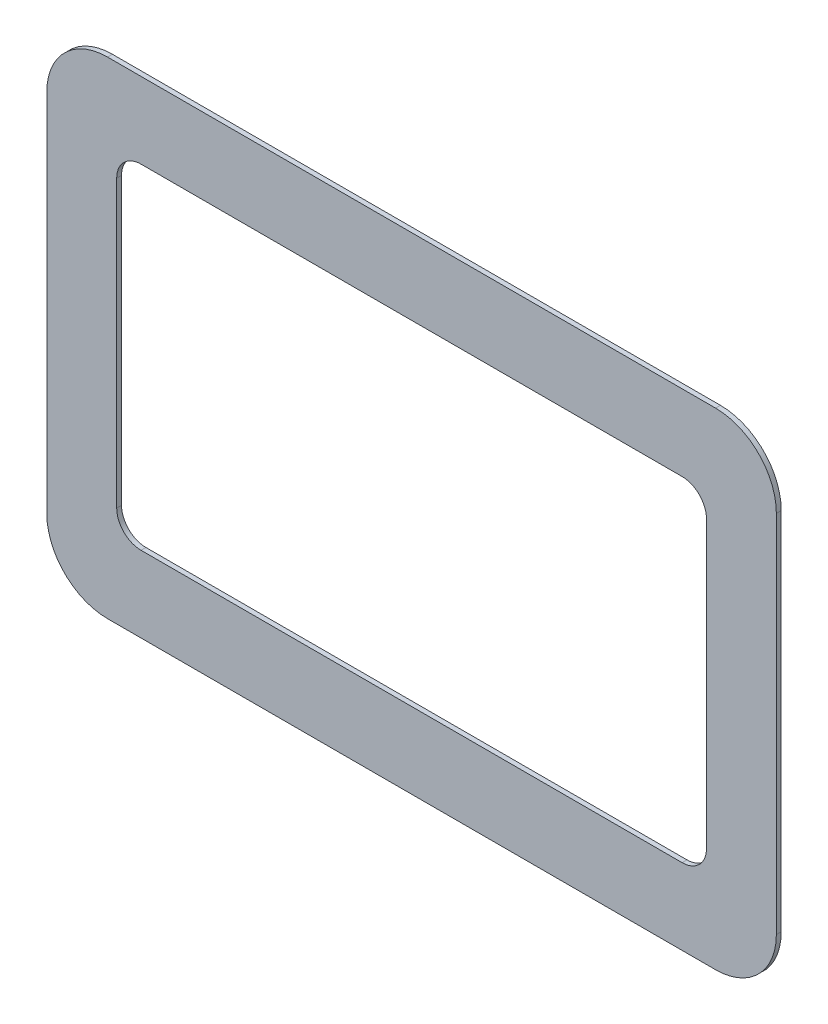
ISO-10303-21;
HEADER;
FILE_DESCRIPTION(('STEP AP214'),'2;1');
FILE_NAME('part.step','',(''),(''),'','','');
FILE_SCHEMA(('AUTOMOTIVE_DESIGN { 1 0 10303 214 1 1 1 1 }'));
ENDSEC;
DATA;
#1=APPLICATION_CONTEXT('core data for automotive mechanical design processes');
#2=APPLICATION_PROTOCOL_DEFINITION('international standard','automotive_design',2000,#1);
#3=PRODUCT_CONTEXT('',#1,'mechanical');
#4=PRODUCT('Part','Part','',(#3));
#5=PRODUCT_RELATED_PRODUCT_CATEGORY('part','',(#4));
#6=PRODUCT_DEFINITION_FORMATION('','',#4);
#7=PRODUCT_DEFINITION_CONTEXT('part definition',#1,'design');
#8=PRODUCT_DEFINITION('design','',#6,#7);
#9=PRODUCT_DEFINITION_SHAPE('','',#8);
#10=(LENGTH_UNIT() NAMED_UNIT(*) SI_UNIT(.MILLI.,.METRE.));
#11=(NAMED_UNIT(*) PLANE_ANGLE_UNIT() SI_UNIT($,.RADIAN.));
#12=(NAMED_UNIT(*) SI_UNIT($,.STERADIAN.) SOLID_ANGLE_UNIT());
#13=UNCERTAINTY_MEASURE_WITH_UNIT(LENGTH_MEASURE(1.E-05),#10,'distance_accuracy_value','');
#14=(GEOMETRIC_REPRESENTATION_CONTEXT(3) GLOBAL_UNCERTAINTY_ASSIGNED_CONTEXT((#13)) GLOBAL_UNIT_ASSIGNED_CONTEXT((#10,
#11,#12)) REPRESENTATION_CONTEXT('',''));
#15=CARTESIAN_POINT('',(0.,0.,0.));
#16=DIRECTION('',(0.,0.,1.));
#17=DIRECTION('',(1.,0.,0.));
#18=AXIS2_PLACEMENT_3D('',#15,#16,#17);
#19=CARTESIAN_POINT('',(289.706390991234,-144.607906080898,4.));
#20=DIRECTION('',(0.,0.,-1.));
#21=DIRECTION('',(-1.,0.,0.));
#22=AXIS2_PLACEMENT_3D('',#19,#20,#21);
#23=CYLINDRICAL_SURFACE('',#22,50.);
#24=CARTESIAN_POINT('',(289.706390991234,-144.607906080898,0.));
#25=DIRECTION('',(0.,0.,1.));
#26=DIRECTION('',(1.,0.,0.));
#27=AXIS2_PLACEMENT_3D('',#24,#25,#26);
#28=CIRCLE('',#27,50.);
#29=CARTESIAN_POINT('',(289.706390991234,-194.607906080898,0.));
#30=VERTEX_POINT('',#29);
#31=CARTESIAN_POINT('',(339.706390991234,-144.607906080898,0.));
#32=VERTEX_POINT('',#31);
#33=EDGE_CURVE('E202',#30,#32,#28,.T.);
#34=ORIENTED_EDGE('',*,*,#33,.T.);
#35=DIRECTION('',(0.,0.,-1.));
#36=VECTOR('',#35,1.);
#37=CARTESIAN_POINT('',(339.706390991234,-144.607906080898,4.));
#38=LINE('',#37,#36);
#39=CARTESIAN_POINT('',(339.706390991234,-144.607906080898,4.));
#40=VERTEX_POINT('',#39);
#41=EDGE_CURVE('E11',#40,#32,#38,.T.);
#42=ORIENTED_EDGE('',*,*,#41,.F.);
#43=CARTESIAN_POINT('',(289.706390991234,-144.607906080898,4.));
#44=DIRECTION('',(0.,0.,1.));
#45=DIRECTION('',(1.,0.,0.));
#46=AXIS2_PLACEMENT_3D('',#43,#44,#45);
#47=CIRCLE('',#46,50.);
#48=CARTESIAN_POINT('',(289.706390991234,-194.607906080898,4.));
#49=VERTEX_POINT('',#48);
#50=EDGE_CURVE('E214',#49,#40,#47,.T.);
#51=ORIENTED_EDGE('',*,*,#50,.F.);
#52=DIRECTION('',(0.,0.,-1.));
#53=VECTOR('',#52,1.);
#54=CARTESIAN_POINT('',(289.706390991234,-194.607906080898,4.));
#55=LINE('',#54,#53);
#56=EDGE_CURVE('E232',#49,#30,#55,.T.);
#57=ORIENTED_EDGE('',*,*,#56,.T.);
#58=EDGE_LOOP('',(#34,#42,#51,#57));
#59=FACE_BOUND('',#58,.T.);
#60=ADVANCED_FACE('F33',(#59),#23,.T.);
#61=CARTESIAN_POINT('',(339.706390991234,-144.607906080898,4.));
#62=DIRECTION('',(-1.,0.,0.));
#63=DIRECTION('',(0.,0.,1.));
#64=AXIS2_PLACEMENT_3D('',#61,#62,#63);
#65=PLANE('',#64);
#66=DIRECTION('',(0.,1.,0.));
#67=VECTOR('',#66,1.);
#68=CARTESIAN_POINT('',(339.706390991234,-144.607906080898,0.));
#69=LINE('',#68,#67);
#70=CARTESIAN_POINT('',(339.706390991234,155.392093919102,0.));
#71=VERTEX_POINT('',#70);
#72=EDGE_CURVE('E235',#32,#71,#69,.T.);
#73=ORIENTED_EDGE('',*,*,#72,.T.);
#74=DIRECTION('',(0.,0.,-1.));
#75=VECTOR('',#74,1.);
#76=CARTESIAN_POINT('',(339.706390991234,155.392093919102,4.));
#77=LINE('',#76,#75);
#78=CARTESIAN_POINT('',(339.706390991234,155.392093919102,4.));
#79=VERTEX_POINT('',#78);
#80=EDGE_CURVE('E40',#79,#71,#77,.T.);
#81=ORIENTED_EDGE('',*,*,#80,.F.);
#82=DIRECTION('',(0.,1.,0.));
#83=VECTOR('',#82,1.);
#84=CARTESIAN_POINT('',(339.706390991234,-144.607906080898,4.));
#85=LINE('',#84,#83);
#86=EDGE_CURVE('E217',#40,#79,#85,.T.);
#87=ORIENTED_EDGE('',*,*,#86,.F.);
#88=ORIENTED_EDGE('',*,*,#41,.T.);
#89=EDGE_LOOP('',(#73,#81,#87,#88));
#90=FACE_BOUND('',#89,.T.);
#91=ADVANCED_FACE('F290',(#90),#65,.F.);
#92=CARTESIAN_POINT('',(289.706390991234,155.392093919102,4.));
#93=DIRECTION('',(0.,0.,-1.));
#94=DIRECTION('',(-1.,0.,0.));
#95=AXIS2_PLACEMENT_3D('',#92,#93,#94);
#96=CYLINDRICAL_SURFACE('',#95,50.);
#97=CARTESIAN_POINT('',(289.706390991234,155.392093919102,0.));
#98=DIRECTION('',(0.,0.,1.));
#99=DIRECTION('',(-1.,0.,0.));
#100=AXIS2_PLACEMENT_3D('',#97,#98,#99);
#101=CIRCLE('',#100,50.);
#102=CARTESIAN_POINT('',(289.706390991234,205.392093919102,0.));
#103=VERTEX_POINT('',#102);
#104=EDGE_CURVE('E237',#71,#103,#101,.T.);
#105=ORIENTED_EDGE('',*,*,#104,.T.);
#106=DIRECTION('',(0.,0.,-1.));
#107=VECTOR('',#106,1.);
#108=CARTESIAN_POINT('',(289.706390991234,205.392093919102,4.));
#109=LINE('',#108,#107);
#110=CARTESIAN_POINT('',(289.706390991234,205.392093919102,4.));
#111=VERTEX_POINT('',#110);
#112=EDGE_CURVE('E262',#111,#103,#109,.T.);
#113=ORIENTED_EDGE('',*,*,#112,.F.);
#114=CARTESIAN_POINT('',(289.706390991234,155.392093919102,4.));
#115=DIRECTION('',(0.,0.,1.));
#116=DIRECTION('',(-1.,0.,0.));
#117=AXIS2_PLACEMENT_3D('',#114,#115,#116);
#118=CIRCLE('',#117,50.);
#119=EDGE_CURVE('E220',#79,#111,#118,.T.);
#120=ORIENTED_EDGE('',*,*,#119,.F.);
#121=ORIENTED_EDGE('',*,*,#80,.T.);
#122=EDGE_LOOP('',(#105,#113,#120,#121));
#123=FACE_BOUND('',#122,.T.);
#124=ADVANCED_FACE('F269',(#123),#96,.T.);
#125=CARTESIAN_POINT('',(-210.293609008766,205.392093919102,4.));
#126=DIRECTION('',(0.,-1.,0.));
#127=DIRECTION('',(0.,0.,-1.));
#128=AXIS2_PLACEMENT_3D('',#125,#126,#127);
#129=PLANE('',#128);
#130=DIRECTION('',(-1.,0.,0.));
#131=VECTOR('',#130,1.);
#132=CARTESIAN_POINT('',(-210.293609008766,205.392093919102,0.));
#133=LINE('',#132,#131);
#134=CARTESIAN_POINT('',(-210.293609008766,205.392093919102,0.));
#135=VERTEX_POINT('',#134);
#136=EDGE_CURVE('E239',#103,#135,#133,.T.);
#137=ORIENTED_EDGE('',*,*,#136,.T.);
#138=DIRECTION('',(0.,0.,-1.));
#139=VECTOR('',#138,1.);
#140=CARTESIAN_POINT('',(-210.293609008766,205.392093919102,4.));
#141=LINE('',#140,#139);
#142=CARTESIAN_POINT('',(-210.293609008766,205.392093919102,4.));
#143=VERTEX_POINT('',#142);
#144=EDGE_CURVE('E259',#143,#135,#141,.T.);
#145=ORIENTED_EDGE('',*,*,#144,.F.);
#146=DIRECTION('',(-1.,0.,0.));
#147=VECTOR('',#146,1.);
#148=CARTESIAN_POINT('',(-210.293609008766,205.392093919102,4.));
#149=LINE('',#148,#147);
#150=EDGE_CURVE('E222',#111,#143,#149,.T.);
#151=ORIENTED_EDGE('',*,*,#150,.F.);
#152=ORIENTED_EDGE('',*,*,#112,.T.);
#153=EDGE_LOOP('',(#137,#145,#151,#152));
#154=FACE_BOUND('',#153,.T.);
#155=ADVANCED_FACE('F278',(#154),#129,.F.);
#156=CARTESIAN_POINT('',(-210.293609008766,155.392093919102,4.));
#157=DIRECTION('',(0.,0.,-1.));
#158=DIRECTION('',(-1.,0.,0.));
#159=AXIS2_PLACEMENT_3D('',#156,#157,#158);
#160=CYLINDRICAL_SURFACE('',#159,50.);
#161=CARTESIAN_POINT('',(-210.293609008766,155.392093919102,0.));
#162=DIRECTION('',(0.,0.,1.));
#163=DIRECTION('',(-1.,0.,0.));
#164=AXIS2_PLACEMENT_3D('',#161,#162,#163);
#165=CIRCLE('',#164,50.);
#166=CARTESIAN_POINT('',(-260.293609008766,155.392093919102,0.));
#167=VERTEX_POINT('',#166);
#168=EDGE_CURVE('E241',#135,#167,#165,.T.);
#169=ORIENTED_EDGE('',*,*,#168,.T.);
#170=DIRECTION('',(0.,0.,-1.));
#171=VECTOR('',#170,1.);
#172=CARTESIAN_POINT('',(-260.293609008766,155.392093919102,4.));
#173=LINE('',#172,#171);
#174=CARTESIAN_POINT('',(-260.293609008766,155.392093919102,4.));
#175=VERTEX_POINT('',#174);
#176=EDGE_CURVE('E256',#175,#167,#173,.T.);
#177=ORIENTED_EDGE('',*,*,#176,.F.);
#178=CARTESIAN_POINT('',(-210.293609008766,155.392093919102,4.));
#179=DIRECTION('',(0.,0.,1.));
#180=DIRECTION('',(-1.,0.,0.));
#181=AXIS2_PLACEMENT_3D('',#178,#179,#180);
#182=CIRCLE('',#181,50.);
#183=EDGE_CURVE('E224',#143,#175,#182,.T.);
#184=ORIENTED_EDGE('',*,*,#183,.F.);
#185=ORIENTED_EDGE('',*,*,#144,.T.);
#186=EDGE_LOOP('',(#169,#177,#184,#185));
#187=FACE_BOUND('',#186,.T.);
#188=ADVANCED_FACE('F282',(#187),#160,.T.);
#189=CARTESIAN_POINT('',(-260.293609008766,-144.607906080898,4.));
#190=DIRECTION('',(1.,0.,0.));
#191=DIRECTION('',(0.,0.,-1.));
#192=AXIS2_PLACEMENT_3D('',#189,#190,#191);
#193=PLANE('',#192);
#194=DIRECTION('',(0.,-1.,0.));
#195=VECTOR('',#194,1.);
#196=CARTESIAN_POINT('',(-260.293609008766,-144.607906080898,0.));
#197=LINE('',#196,#195);
#198=CARTESIAN_POINT('',(-260.293609008766,-144.607906080898,0.));
#199=VERTEX_POINT('',#198);
#200=EDGE_CURVE('E243',#167,#199,#197,.T.);
#201=ORIENTED_EDGE('',*,*,#200,.T.);
#202=DIRECTION('',(0.,0.,-1.));
#203=VECTOR('',#202,1.);
#204=CARTESIAN_POINT('',(-260.293609008766,-144.607906080898,4.));
#205=LINE('',#204,#203);
#206=CARTESIAN_POINT('',(-260.293609008766,-144.607906080898,4.));
#207=VERTEX_POINT('',#206);
#208=EDGE_CURVE('E253',#207,#199,#205,.T.);
#209=ORIENTED_EDGE('',*,*,#208,.F.);
#210=DIRECTION('',(0.,-1.,0.));
#211=VECTOR('',#210,1.);
#212=CARTESIAN_POINT('',(-260.293609008766,-144.607906080898,4.));
#213=LINE('',#212,#211);
#214=EDGE_CURVE('E226',#175,#207,#213,.T.);
#215=ORIENTED_EDGE('',*,*,#214,.F.);
#216=ORIENTED_EDGE('',*,*,#176,.T.);
#217=EDGE_LOOP('',(#201,#209,#215,#216));
#218=FACE_BOUND('',#217,.T.);
#219=ADVANCED_FACE('F303',(#218),#193,.F.);
#220=CARTESIAN_POINT('',(-210.293609008766,-144.607906080898,4.));
#221=DIRECTION('',(0.,0.,-1.));
#222=DIRECTION('',(-1.,0.,0.));
#223=AXIS2_PLACEMENT_3D('',#220,#221,#222);
#224=CYLINDRICAL_SURFACE('',#223,50.);
#225=CARTESIAN_POINT('',(-210.293609008766,-144.607906080898,0.));
#226=DIRECTION('',(0.,0.,1.));
#227=DIRECTION('',(-1.,0.,0.));
#228=AXIS2_PLACEMENT_3D('',#225,#226,#227);
#229=CIRCLE('',#228,50.);
#230=CARTESIAN_POINT('',(-210.293609008765,-194.607906080898,0.));
#231=VERTEX_POINT('',#230);
#232=EDGE_CURVE('E245',#199,#231,#229,.T.);
#233=ORIENTED_EDGE('',*,*,#232,.T.);
#234=DIRECTION('',(0.,0.,-1.));
#235=VECTOR('',#234,1.);
#236=CARTESIAN_POINT('',(-210.293609008765,-194.607906080898,4.));
#237=LINE('',#236,#235);
#238=CARTESIAN_POINT('',(-210.293609008765,-194.607906080898,4.));
#239=VERTEX_POINT('',#238);
#240=EDGE_CURVE('E250',#239,#231,#237,.T.);
#241=ORIENTED_EDGE('',*,*,#240,.F.);
#242=CARTESIAN_POINT('',(-210.293609008766,-144.607906080898,4.));
#243=DIRECTION('',(0.,0.,1.));
#244=DIRECTION('',(-1.,0.,0.));
#245=AXIS2_PLACEMENT_3D('',#242,#243,#244);
#246=CIRCLE('',#245,50.);
#247=EDGE_CURVE('E228',#207,#239,#246,.T.);
#248=ORIENTED_EDGE('',*,*,#247,.F.);
#249=ORIENTED_EDGE('',*,*,#208,.T.);
#250=EDGE_LOOP('',(#233,#241,#248,#249));
#251=FACE_BOUND('',#250,.T.);
#252=ADVANCED_FACE('F301',(#251),#224,.T.);
#253=CARTESIAN_POINT('',(-210.293609008765,-194.607906080898,4.));
#254=DIRECTION('',(0.,1.,0.));
#255=DIRECTION('',(0.,0.,1.));
#256=AXIS2_PLACEMENT_3D('',#253,#254,#255);
#257=PLANE('',#256);
#258=DIRECTION('',(1.,0.,0.));
#259=VECTOR('',#258,1.);
#260=CARTESIAN_POINT('',(-210.293609008765,-194.607906080898,0.));
#261=LINE('',#260,#259);
#262=EDGE_CURVE('E218',#231,#30,#261,.T.);
#263=ORIENTED_EDGE('',*,*,#262,.T.);
#264=ORIENTED_EDGE('',*,*,#56,.F.);
#265=DIRECTION('',(1.,0.,0.));
#266=VECTOR('',#265,1.);
#267=CARTESIAN_POINT('',(-210.293609008765,-194.607906080898,4.));
#268=LINE('',#267,#266);
#269=EDGE_CURVE('E230',#239,#49,#268,.T.);
#270=ORIENTED_EDGE('',*,*,#269,.F.);
#271=ORIENTED_EDGE('',*,*,#240,.T.);
#272=EDGE_LOOP('',(#263,#264,#270,#271));
#273=FACE_BOUND('',#272,.T.);
#274=ADVANCED_FACE('F296',(#273),#257,.F.);
#275=CARTESIAN_POINT('',(289.706390991234,-144.607906080898,4.));
#276=DIRECTION('',(0.,0.,1.));
#277=DIRECTION('',(1.,0.,0.));
#278=AXIS2_PLACEMENT_3D('',#275,#276,#277);
#279=PLANE('',#278);
#280=CARTESIAN_POINT('',(262.206390991234,-112.107906080898,4.));
#281=DIRECTION('',(0.,0.,1.));
#282=DIRECTION('',(1.,0.,0.));
#283=AXIS2_PLACEMENT_3D('',#280,#281,#282);
#284=CIRCLE('',#283,20.);
#285=CARTESIAN_POINT('',(262.206390991234,-132.107906080898,4.));
#286=VERTEX_POINT('',#285);
#287=CARTESIAN_POINT('',(282.206390991234,-112.107906080898,4.));
#288=VERTEX_POINT('',#287);
#289=EDGE_CURVE('E47',#286,#288,#284,.T.);
#290=ORIENTED_EDGE('',*,*,#289,.F.);
#291=DIRECTION('',(1.,0.,0.));
#292=VECTOR('',#291,1.);
#293=CARTESIAN_POINT('',(-182.793609008766,-132.107906080898,4.));
#294=LINE('',#293,#292);
#295=CARTESIAN_POINT('',(-182.793609008766,-132.107906080898,4.));
#296=VERTEX_POINT('',#295);
#297=EDGE_CURVE('E164',#296,#286,#294,.T.);
#298=ORIENTED_EDGE('',*,*,#297,.F.);
#299=CARTESIAN_POINT('',(-182.793609008766,-112.107906080898,4.));
#300=DIRECTION('',(0.,0.,1.));
#301=DIRECTION('',(-1.,0.,0.));
#302=AXIS2_PLACEMENT_3D('',#299,#300,#301);
#303=CIRCLE('',#302,20.);
#304=CARTESIAN_POINT('',(-202.793609008766,-112.107906080898,4.));
#305=VERTEX_POINT('',#304);
#306=EDGE_CURVE('E167',#305,#296,#303,.T.);
#307=ORIENTED_EDGE('',*,*,#306,.F.);
#308=DIRECTION('',(0.,-1.,0.));
#309=VECTOR('',#308,1.);
#310=CARTESIAN_POINT('',(-202.793609008766,-112.107906080898,4.));
#311=LINE('',#310,#309);
#312=CARTESIAN_POINT('',(-202.793609008766,122.892093919102,4.));
#313=VERTEX_POINT('',#312);
#314=EDGE_CURVE('E195',#313,#305,#311,.T.);
#315=ORIENTED_EDGE('',*,*,#314,.F.);
#316=CARTESIAN_POINT('',(-182.793609008766,122.892093919102,4.));
#317=DIRECTION('',(0.,0.,1.));
#318=DIRECTION('',(-1.,0.,0.));
#319=AXIS2_PLACEMENT_3D('',#316,#317,#318);
#320=CIRCLE('',#319,20.);
#321=CARTESIAN_POINT('',(-182.793609008766,142.892093919102,4.));
#322=VERTEX_POINT('',#321);
#323=EDGE_CURVE('E192',#322,#313,#320,.T.);
#324=ORIENTED_EDGE('',*,*,#323,.F.);
#325=DIRECTION('',(-1.,0.,0.));
#326=VECTOR('',#325,1.);
#327=CARTESIAN_POINT('',(-182.793609008766,142.892093919102,4.));
#328=LINE('',#327,#326);
#329=CARTESIAN_POINT('',(262.206390991234,142.892093919102,4.));
#330=VERTEX_POINT('',#329);
#331=EDGE_CURVE('E189',#330,#322,#328,.T.);
#332=ORIENTED_EDGE('',*,*,#331,.F.);
#333=CARTESIAN_POINT('',(262.206390991234,122.892093919102,4.));
#334=DIRECTION('',(0.,0.,1.));
#335=DIRECTION('',(-1.,0.,0.));
#336=AXIS2_PLACEMENT_3D('',#333,#334,#335);
#337=CIRCLE('',#336,20.);
#338=CARTESIAN_POINT('',(282.206390991234,122.892093919102,4.));
#339=VERTEX_POINT('',#338);
#340=EDGE_CURVE('E186',#339,#330,#337,.T.);
#341=ORIENTED_EDGE('',*,*,#340,.F.);
#342=DIRECTION('',(0.,1.,0.));
#343=VECTOR('',#342,1.);
#344=CARTESIAN_POINT('',(282.206390991234,-112.107906080898,4.));
#345=LINE('',#344,#343);
#346=EDGE_CURVE('E184',#288,#339,#345,.T.);
#347=ORIENTED_EDGE('',*,*,#346,.F.);
#348=EDGE_LOOP('',(#290,#298,#307,#315,#324,#332,#341,#347));
#349=FACE_BOUND('',#348,.T.);
#350=ORIENTED_EDGE('',*,*,#50,.T.);
#351=ORIENTED_EDGE('',*,*,#86,.T.);
#352=ORIENTED_EDGE('',*,*,#119,.T.);
#353=ORIENTED_EDGE('',*,*,#150,.T.);
#354=ORIENTED_EDGE('',*,*,#183,.T.);
#355=ORIENTED_EDGE('',*,*,#214,.T.);
#356=ORIENTED_EDGE('',*,*,#247,.T.);
#357=ORIENTED_EDGE('',*,*,#269,.T.);
#358=EDGE_LOOP('',(#350,#351,#352,#353,#354,#355,#356,#357));
#359=FACE_BOUND('',#358,.T.);
#360=ADVANCED_FACE('F286',(#349,#359),#279,.T.);
#361=CARTESIAN_POINT('',(289.706390991234,-144.607906080898,0.));
#362=DIRECTION('',(0.,0.,1.));
#363=DIRECTION('',(1.,0.,0.));
#364=AXIS2_PLACEMENT_3D('',#361,#362,#363);
#365=PLANE('',#364);
#366=DIRECTION('',(1.,0.,0.));
#367=VECTOR('',#366,1.);
#368=CARTESIAN_POINT('',(-182.793609008766,-132.107906080898,0.));
#369=LINE('',#368,#367);
#370=CARTESIAN_POINT('',(-182.793609008766,-132.107906080898,0.));
#371=VERTEX_POINT('',#370);
#372=CARTESIAN_POINT('',(262.206390991234,-132.107906080898,0.));
#373=VERTEX_POINT('',#372);
#374=EDGE_CURVE('E153',#371,#373,#369,.T.);
#375=ORIENTED_EDGE('',*,*,#374,.T.);
#376=CARTESIAN_POINT('',(262.206390991234,-112.107906080898,0.));
#377=DIRECTION('',(0.,0.,1.));
#378=DIRECTION('',(1.,0.,0.));
#379=AXIS2_PLACEMENT_3D('',#376,#377,#378);
#380=CIRCLE('',#379,20.);
#381=CARTESIAN_POINT('',(282.206390991234,-112.107906080898,0.));
#382=VERTEX_POINT('',#381);
#383=EDGE_CURVE('E147',#373,#382,#380,.T.);
#384=ORIENTED_EDGE('',*,*,#383,.T.);
#385=DIRECTION('',(0.,1.,0.));
#386=VECTOR('',#385,1.);
#387=CARTESIAN_POINT('',(282.206390991234,-112.107906080898,0.));
#388=LINE('',#387,#386);
#389=CARTESIAN_POINT('',(282.206390991234,122.892093919102,0.));
#390=VERTEX_POINT('',#389);
#391=EDGE_CURVE('E156',#382,#390,#388,.T.);
#392=ORIENTED_EDGE('',*,*,#391,.T.);
#393=CARTESIAN_POINT('',(262.206390991234,122.892093919102,0.));
#394=DIRECTION('',(0.,0.,1.));
#395=DIRECTION('',(-1.,0.,0.));
#396=AXIS2_PLACEMENT_3D('',#393,#394,#395);
#397=CIRCLE('',#396,20.);
#398=CARTESIAN_POINT('',(262.206390991234,142.892093919102,0.));
#399=VERTEX_POINT('',#398);
#400=EDGE_CURVE('E55',#390,#399,#397,.T.);
#401=ORIENTED_EDGE('',*,*,#400,.T.);
#402=DIRECTION('',(-1.,0.,0.));
#403=VECTOR('',#402,1.);
#404=CARTESIAN_POINT('',(-182.793609008766,142.892093919102,0.));
#405=LINE('',#404,#403);
#406=CARTESIAN_POINT('',(-182.793609008766,142.892093919102,0.));
#407=VERTEX_POINT('',#406);
#408=EDGE_CURVE('E171',#399,#407,#405,.T.);
#409=ORIENTED_EDGE('',*,*,#408,.T.);
#410=CARTESIAN_POINT('',(-182.793609008766,122.892093919102,0.));
#411=DIRECTION('',(0.,0.,1.));
#412=DIRECTION('',(-1.,0.,0.));
#413=AXIS2_PLACEMENT_3D('',#410,#411,#412);
#414=CIRCLE('',#413,20.);
#415=CARTESIAN_POINT('',(-202.793609008766,122.892093919102,0.));
#416=VERTEX_POINT('',#415);
#417=EDGE_CURVE('E174',#407,#416,#414,.T.);
#418=ORIENTED_EDGE('',*,*,#417,.T.);
#419=DIRECTION('',(0.,-1.,0.));
#420=VECTOR('',#419,1.);
#421=CARTESIAN_POINT('',(-202.793609008766,-112.107906080898,0.));
#422=LINE('',#421,#420);
#423=CARTESIAN_POINT('',(-202.793609008766,-112.107906080898,0.));
#424=VERTEX_POINT('',#423);
#425=EDGE_CURVE('E177',#416,#424,#422,.T.);
#426=ORIENTED_EDGE('',*,*,#425,.T.);
#427=CARTESIAN_POINT('',(-182.793609008766,-112.107906080898,0.));
#428=DIRECTION('',(0.,0.,1.));
#429=DIRECTION('',(-1.,0.,0.));
#430=AXIS2_PLACEMENT_3D('',#427,#428,#429);
#431=CIRCLE('',#430,20.);
#432=EDGE_CURVE('E180',#424,#371,#431,.T.);
#433=ORIENTED_EDGE('',*,*,#432,.T.);
#434=EDGE_LOOP('',(#375,#384,#392,#401,#409,#418,#426,#433));
#435=FACE_BOUND('',#434,.T.);
#436=ORIENTED_EDGE('',*,*,#33,.F.);
#437=ORIENTED_EDGE('',*,*,#262,.F.);
#438=ORIENTED_EDGE('',*,*,#232,.F.);
#439=ORIENTED_EDGE('',*,*,#200,.F.);
#440=ORIENTED_EDGE('',*,*,#168,.F.);
#441=ORIENTED_EDGE('',*,*,#136,.F.);
#442=ORIENTED_EDGE('',*,*,#104,.F.);
#443=ORIENTED_EDGE('',*,*,#72,.F.);
#444=EDGE_LOOP('',(#436,#437,#438,#439,#440,#441,#442,#443));
#445=FACE_BOUND('',#444,.T.);
#446=ADVANCED_FACE('F160',(#435,#445),#365,.F.);
#447=CARTESIAN_POINT('',(262.206390991234,-112.107906080898,0.));
#448=DIRECTION('',(0.,0.,1.));
#449=DIRECTION('',(1.,0.,0.));
#450=AXIS2_PLACEMENT_3D('',#447,#448,#449);
#451=CYLINDRICAL_SURFACE('',#450,20.);
#452=ORIENTED_EDGE('',*,*,#289,.T.);
#453=DIRECTION('',(0.,0.,1.));
#454=VECTOR('',#453,1.);
#455=CARTESIAN_POINT('',(282.206390991234,-112.107906080898,0.));
#456=LINE('',#455,#454);
#457=EDGE_CURVE('E143',#382,#288,#456,.T.);
#458=ORIENTED_EDGE('',*,*,#457,.F.);
#459=ORIENTED_EDGE('',*,*,#383,.F.);
#460=DIRECTION('',(0.,0.,1.));
#461=VECTOR('',#460,1.);
#462=CARTESIAN_POINT('',(262.206390991234,-132.107906080898,0.));
#463=LINE('',#462,#461);
#464=EDGE_CURVE('E200',#373,#286,#463,.T.);
#465=ORIENTED_EDGE('',*,*,#464,.T.);
#466=EDGE_LOOP('',(#452,#458,#459,#465));
#467=FACE_BOUND('',#466,.T.);
#468=ADVANCED_FACE('F145',(#467),#451,.F.);
#469=CARTESIAN_POINT('',(-182.793609008766,-132.107906080898,0.));
#470=DIRECTION('',(0.,-1.,0.));
#471=DIRECTION('',(0.,0.,-1.));
#472=AXIS2_PLACEMENT_3D('',#469,#470,#471);
#473=PLANE('',#472);
#474=ORIENTED_EDGE('',*,*,#297,.T.);
#475=ORIENTED_EDGE('',*,*,#464,.F.);
#476=ORIENTED_EDGE('',*,*,#374,.F.);
#477=DIRECTION('',(0.,0.,1.));
#478=VECTOR('',#477,1.);
#479=CARTESIAN_POINT('',(-182.793609008766,-132.107906080898,0.));
#480=LINE('',#479,#478);
#481=EDGE_CURVE('E203',#371,#296,#480,.T.);
#482=ORIENTED_EDGE('',*,*,#481,.T.);
#483=EDGE_LOOP('',(#474,#475,#476,#482));
#484=FACE_BOUND('',#483,.T.);
#485=ADVANCED_FACE('F374',(#484),#473,.F.);
#486=CARTESIAN_POINT('',(-182.793609008766,-112.107906080898,0.));
#487=DIRECTION('',(0.,0.,1.));
#488=DIRECTION('',(1.,0.,0.));
#489=AXIS2_PLACEMENT_3D('',#486,#487,#488);
#490=CYLINDRICAL_SURFACE('',#489,20.);
#491=ORIENTED_EDGE('',*,*,#306,.T.);
#492=ORIENTED_EDGE('',*,*,#481,.F.);
#493=ORIENTED_EDGE('',*,*,#432,.F.);
#494=DIRECTION('',(0.,0.,1.));
#495=VECTOR('',#494,1.);
#496=CARTESIAN_POINT('',(-202.793609008766,-112.107906080898,0.));
#497=LINE('',#496,#495);
#498=EDGE_CURVE('E205',#424,#305,#497,.T.);
#499=ORIENTED_EDGE('',*,*,#498,.T.);
#500=EDGE_LOOP('',(#491,#492,#493,#499));
#501=FACE_BOUND('',#500,.T.);
#502=ADVANCED_FACE('F383',(#501),#490,.F.);
#503=CARTESIAN_POINT('',(-202.793609008766,-112.107906080898,0.));
#504=DIRECTION('',(-1.,0.,0.));
#505=DIRECTION('',(0.,0.,1.));
#506=AXIS2_PLACEMENT_3D('',#503,#504,#505);
#507=PLANE('',#506);
#508=ORIENTED_EDGE('',*,*,#314,.T.);
#509=ORIENTED_EDGE('',*,*,#498,.F.);
#510=ORIENTED_EDGE('',*,*,#425,.F.);
#511=DIRECTION('',(0.,0.,1.));
#512=VECTOR('',#511,1.);
#513=CARTESIAN_POINT('',(-202.793609008766,122.892093919102,0.));
#514=LINE('',#513,#512);
#515=EDGE_CURVE('E207',#416,#313,#514,.T.);
#516=ORIENTED_EDGE('',*,*,#515,.T.);
#517=EDGE_LOOP('',(#508,#509,#510,#516));
#518=FACE_BOUND('',#517,.T.);
#519=ADVANCED_FACE('F393',(#518),#507,.F.);
#520=CARTESIAN_POINT('',(-182.793609008766,122.892093919102,0.));
#521=DIRECTION('',(0.,0.,1.));
#522=DIRECTION('',(1.,0.,0.));
#523=AXIS2_PLACEMENT_3D('',#520,#521,#522);
#524=CYLINDRICAL_SURFACE('',#523,20.);
#525=ORIENTED_EDGE('',*,*,#323,.T.);
#526=ORIENTED_EDGE('',*,*,#515,.F.);
#527=ORIENTED_EDGE('',*,*,#417,.F.);
#528=DIRECTION('',(0.,0.,1.));
#529=VECTOR('',#528,1.);
#530=CARTESIAN_POINT('',(-182.793609008766,142.892093919102,0.));
#531=LINE('',#530,#529);
#532=EDGE_CURVE('E209',#407,#322,#531,.T.);
#533=ORIENTED_EDGE('',*,*,#532,.T.);
#534=EDGE_LOOP('',(#525,#526,#527,#533));
#535=FACE_BOUND('',#534,.T.);
#536=ADVANCED_FACE('F403',(#535),#524,.F.);
#537=CARTESIAN_POINT('',(-182.793609008766,142.892093919102,0.));
#538=DIRECTION('',(0.,1.,0.));
#539=DIRECTION('',(0.,0.,1.));
#540=AXIS2_PLACEMENT_3D('',#537,#538,#539);
#541=PLANE('',#540);
#542=ORIENTED_EDGE('',*,*,#331,.T.);
#543=ORIENTED_EDGE('',*,*,#532,.F.);
#544=ORIENTED_EDGE('',*,*,#408,.F.);
#545=DIRECTION('',(0.,0.,1.));
#546=VECTOR('',#545,1.);
#547=CARTESIAN_POINT('',(262.206390991234,142.892093919102,0.));
#548=LINE('',#547,#546);
#549=EDGE_CURVE('E211',#399,#330,#548,.T.);
#550=ORIENTED_EDGE('',*,*,#549,.T.);
#551=EDGE_LOOP('',(#542,#543,#544,#550));
#552=FACE_BOUND('',#551,.T.);
#553=ADVANCED_FACE('F413',(#552),#541,.F.);
#554=CARTESIAN_POINT('',(262.206390991234,122.892093919102,0.));
#555=DIRECTION('',(0.,0.,1.));
#556=DIRECTION('',(1.,0.,0.));
#557=AXIS2_PLACEMENT_3D('',#554,#555,#556);
#558=CYLINDRICAL_SURFACE('',#557,20.);
#559=ORIENTED_EDGE('',*,*,#340,.T.);
#560=ORIENTED_EDGE('',*,*,#549,.F.);
#561=ORIENTED_EDGE('',*,*,#400,.F.);
#562=DIRECTION('',(0.,0.,1.));
#563=VECTOR('',#562,1.);
#564=CARTESIAN_POINT('',(282.206390991234,122.892093919102,0.));
#565=LINE('',#564,#563);
#566=EDGE_CURVE('E152',#390,#339,#565,.T.);
#567=ORIENTED_EDGE('',*,*,#566,.T.);
#568=EDGE_LOOP('',(#559,#560,#561,#567));
#569=FACE_BOUND('',#568,.T.);
#570=ADVANCED_FACE('F423',(#569),#558,.F.);
#571=CARTESIAN_POINT('',(282.206390991234,-112.107906080898,0.));
#572=DIRECTION('',(1.,0.,0.));
#573=DIRECTION('',(0.,0.,-1.));
#574=AXIS2_PLACEMENT_3D('',#571,#572,#573);
#575=PLANE('',#574);
#576=ORIENTED_EDGE('',*,*,#346,.T.);
#577=ORIENTED_EDGE('',*,*,#566,.F.);
#578=ORIENTED_EDGE('',*,*,#391,.F.);
#579=ORIENTED_EDGE('',*,*,#457,.T.);
#580=EDGE_LOOP('',(#576,#577,#578,#579));
#581=FACE_BOUND('',#580,.T.);
#582=ADVANCED_FACE('F157',(#581),#575,.F.);
#583=CLOSED_SHELL('',(#60,#91,#124,#155,#188,#219,#252,#274,#360,#446,#468,#485,#502,#519,#536,
#553,#570,#582));
#584=MANIFOLD_SOLID_BREP('B2',#583);
#585=ADVANCED_BREP_SHAPE_REPRESENTATION('',(#18,#584),#14);
#586=SHAPE_DEFINITION_REPRESENTATION(#9,#585);
ENDSEC;
END-ISO-10303-21;
